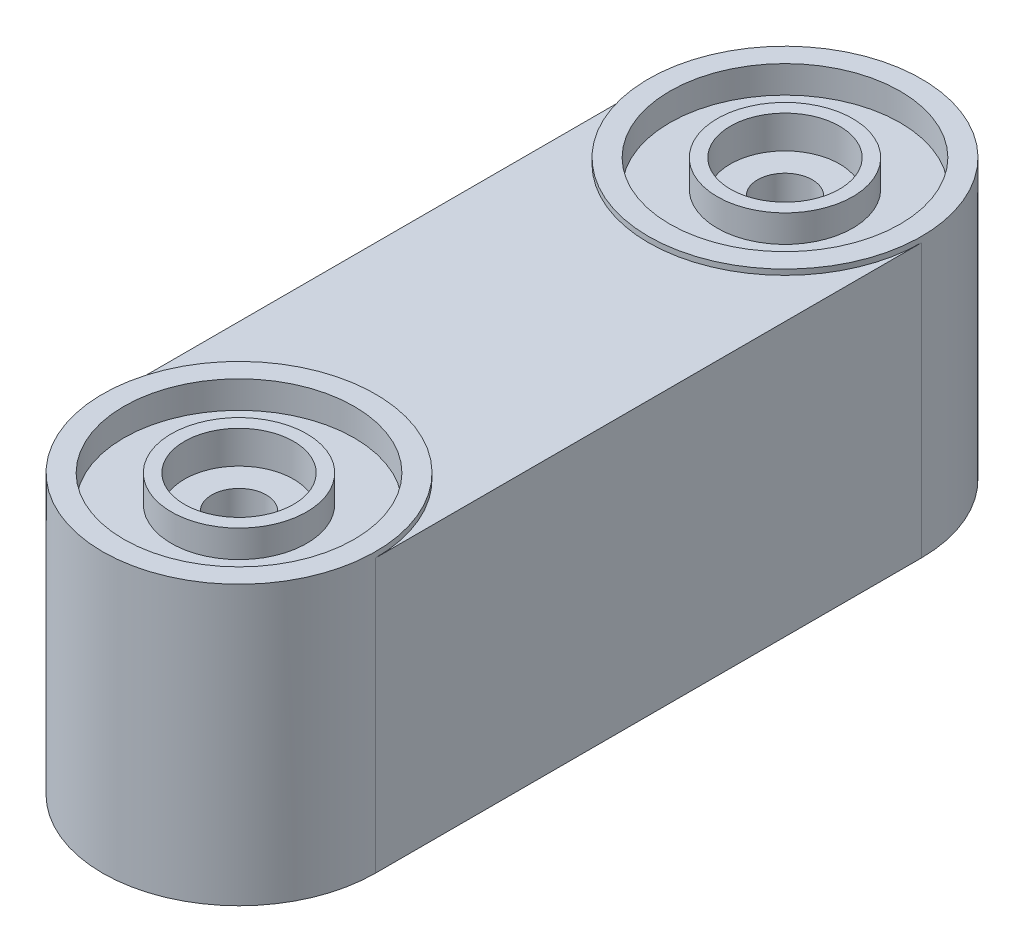
ISO-10303-21;
HEADER;
FILE_DESCRIPTION(('STEP AP214'),'2;1');
FILE_NAME('part.step','',(''),(''),'','','');
FILE_SCHEMA(('AUTOMOTIVE_DESIGN { 1 0 10303 214 1 1 1 1 }'));
ENDSEC;
DATA;
#1=APPLICATION_CONTEXT('core data for automotive mechanical design processes');
#2=APPLICATION_PROTOCOL_DEFINITION('international standard','automotive_design',2000,#1);
#3=PRODUCT_CONTEXT('',#1,'mechanical');
#4=PRODUCT('Part','Part','',(#3));
#5=PRODUCT_RELATED_PRODUCT_CATEGORY('part','',(#4));
#6=PRODUCT_DEFINITION_FORMATION('','',#4);
#7=PRODUCT_DEFINITION_CONTEXT('part definition',#1,'design');
#8=PRODUCT_DEFINITION('design','',#6,#7);
#9=PRODUCT_DEFINITION_SHAPE('','',#8);
#10=(LENGTH_UNIT() NAMED_UNIT(*) SI_UNIT(.MILLI.,.METRE.));
#11=(NAMED_UNIT(*) PLANE_ANGLE_UNIT() SI_UNIT($,.RADIAN.));
#12=(NAMED_UNIT(*) SI_UNIT($,.STERADIAN.) SOLID_ANGLE_UNIT());
#13=UNCERTAINTY_MEASURE_WITH_UNIT(LENGTH_MEASURE(1.E-05),#10,'distance_accuracy_value','');
#14=(GEOMETRIC_REPRESENTATION_CONTEXT(3) GLOBAL_UNCERTAINTY_ASSIGNED_CONTEXT((#13)) GLOBAL_UNIT_ASSIGNED_CONTEXT((#10,
#11,#12)) REPRESENTATION_CONTEXT('',''));
#15=CARTESIAN_POINT('',(0.,0.,0.));
#16=DIRECTION('',(0.,0.,1.));
#17=DIRECTION('',(1.,0.,0.));
#18=AXIS2_PLACEMENT_3D('',#15,#16,#17);
#19=CARTESIAN_POINT('',(0.,26.,0.));
#20=DIRECTION('',(0.,-1.,0.));
#21=DIRECTION('',(0.,0.,-1.));
#22=AXIS2_PLACEMENT_3D('',#19,#20,#21);
#23=PLANE('',#22);
#24=CARTESIAN_POINT('',(0.,26.,125.));
#25=DIRECTION('',(0.,1.,0.));
#26=DIRECTION('',(0.,0.,1.));
#27=AXIS2_PLACEMENT_3D('',#24,#25,#26);
#28=CIRCLE('',#27,10.);
#29=CARTESIAN_POINT('',(0.,26.,135.));
#30=VERTEX_POINT('',#29);
#31=EDGE_CURVE('E193',#30,#30,#28,.T.);
#32=ORIENTED_EDGE('',*,*,#31,.F.);
#33=EDGE_LOOP('',(#32));
#34=FACE_BOUND('',#33,.T.);
#35=CARTESIAN_POINT('',(0.,26.,125.));
#36=DIRECTION('',(0.,1.,0.));
#37=DIRECTION('',(0.,0.,-1.));
#38=AXIS2_PLACEMENT_3D('',#35,#36,#37);
#39=CIRCLE('',#38,12.4);
#40=CARTESIAN_POINT('',(0.,26.,112.6));
#41=VERTEX_POINT('',#40);
#42=EDGE_CURVE('E333',#41,#41,#39,.T.);
#43=ORIENTED_EDGE('',*,*,#42,.T.);
#44=EDGE_LOOP('',(#43));
#45=FACE_BOUND('',#44,.T.);
#46=ADVANCED_FACE('F93',(#34,#45),#23,.F.);
#47=CARTESIAN_POINT('',(0.,26.,0.));
#48=DIRECTION('',(0.,1.,0.));
#49=DIRECTION('',(0.,0.,1.));
#50=AXIS2_PLACEMENT_3D('',#47,#48,#49);
#51=PLANE('',#50);
#52=CARTESIAN_POINT('',(0.,26.,25.));
#53=DIRECTION('',(0.,1.,0.));
#54=DIRECTION('',(0.,0.,1.));
#55=AXIS2_PLACEMENT_3D('',#52,#53,#54);
#56=CIRCLE('',#55,10.);
#57=CARTESIAN_POINT('',(0.,26.,35.));
#58=VERTEX_POINT('',#57);
#59=EDGE_CURVE('E196',#58,#58,#56,.T.);
#60=ORIENTED_EDGE('',*,*,#59,.F.);
#61=EDGE_LOOP('',(#60));
#62=FACE_BOUND('',#61,.T.);
#63=CARTESIAN_POINT('',(0.,26.,25.));
#64=DIRECTION('',(0.,1.,0.));
#65=DIRECTION('',(0.,0.,1.));
#66=AXIS2_PLACEMENT_3D('',#63,#64,#65);
#67=CIRCLE('',#66,12.4);
#68=CARTESIAN_POINT('',(0.,26.,37.4));
#69=VERTEX_POINT('',#68);
#70=EDGE_CURVE('E331',#69,#69,#67,.T.);
#71=ORIENTED_EDGE('',*,*,#70,.T.);
#72=EDGE_LOOP('',(#71));
#73=FACE_BOUND('',#72,.T.);
#74=ADVANCED_FACE('F232',(#62,#73),#51,.T.);
#75=CARTESIAN_POINT('',(0.,-49.,25.));
#76=DIRECTION('',(0.,1.,0.));
#77=DIRECTION('',(0.,0.,1.));
#78=AXIS2_PLACEMENT_3D('',#75,#76,#77);
#79=CYLINDRICAL_SURFACE('',#78,5.);
#80=CARTESIAN_POINT('',(0.,20.,25.));
#81=DIRECTION('',(0.,1.,0.));
#82=DIRECTION('',(0.,0.,1.));
#83=AXIS2_PLACEMENT_3D('',#80,#81,#82);
#84=CIRCLE('',#83,5.);
#85=CARTESIAN_POINT('',(0.,20.,30.));
#86=VERTEX_POINT('',#85);
#87=EDGE_CURVE('E163',#86,#86,#84,.F.);
#88=ORIENTED_EDGE('',*,*,#87,.F.);
#89=EDGE_LOOP('',(#88));
#90=FACE_BOUND('',#89,.T.);
#91=CARTESIAN_POINT('',(0.,-19.,25.));
#92=DIRECTION('',(0.,-1.,0.));
#93=DIRECTION('',(0.,0.,-1.));
#94=AXIS2_PLACEMENT_3D('',#91,#92,#93);
#95=CIRCLE('',#94,5.);
#96=CARTESIAN_POINT('',(0.,-19.,20.));
#97=VERTEX_POINT('',#96);
#98=EDGE_CURVE('E97',#97,#97,#95,.F.);
#99=ORIENTED_EDGE('',*,*,#98,.F.);
#100=EDGE_LOOP('',(#99));
#101=FACE_BOUND('',#100,.T.);
#102=ADVANCED_FACE('F242',(#90,#101),#79,.F.);
#103=CARTESIAN_POINT('',(0.,-49.,125.));
#104=DIRECTION('',(0.,1.,0.));
#105=DIRECTION('',(0.,0.,1.));
#106=AXIS2_PLACEMENT_3D('',#103,#104,#105);
#107=CYLINDRICAL_SURFACE('',#106,5.);
#108=CARTESIAN_POINT('',(0.,20.,125.));
#109=DIRECTION('',(0.,1.,0.));
#110=DIRECTION('',(0.,0.,1.));
#111=AXIS2_PLACEMENT_3D('',#108,#109,#110);
#112=CIRCLE('',#111,5.);
#113=CARTESIAN_POINT('',(0.,20.,130.));
#114=VERTEX_POINT('',#113);
#115=EDGE_CURVE('E160',#114,#114,#112,.F.);
#116=ORIENTED_EDGE('',*,*,#115,.F.);
#117=EDGE_LOOP('',(#116));
#118=FACE_BOUND('',#117,.T.);
#119=CARTESIAN_POINT('',(0.,-19.,125.));
#120=DIRECTION('',(0.,-1.,0.));
#121=DIRECTION('',(0.,0.,-1.));
#122=AXIS2_PLACEMENT_3D('',#119,#120,#121);
#123=CIRCLE('',#122,5.);
#124=CARTESIAN_POINT('',(0.,-19.,120.));
#125=VERTEX_POINT('',#124);
#126=EDGE_CURVE('E166',#125,#125,#123,.F.);
#127=ORIENTED_EDGE('',*,*,#126,.F.);
#128=EDGE_LOOP('',(#127));
#129=FACE_BOUND('',#128,.T.);
#130=ADVANCED_FACE('F268',(#118,#129),#107,.F.);
#131=CARTESIAN_POINT('',(-25.,-25.,150.));
#132=DIRECTION('',(0.,1.,0.));
#133=DIRECTION('',(0.,0.,1.));
#134=AXIS2_PLACEMENT_3D('',#131,#132,#133);
#135=PLANE('',#134);
#136=CARTESIAN_POINT('',(0.,-25.,125.));
#137=DIRECTION('',(0.,-1.,0.));
#138=DIRECTION('',(0.,0.,-1.));
#139=AXIS2_PLACEMENT_3D('',#136,#137,#138);
#140=CIRCLE('',#139,10.);
#141=CARTESIAN_POINT('',(0.,-25.,115.));
#142=VERTEX_POINT('',#141);
#143=EDGE_CURVE('E174',#142,#142,#140,.T.);
#144=ORIENTED_EDGE('',*,*,#143,.F.);
#145=EDGE_LOOP('',(#144));
#146=FACE_BOUND('',#145,.T.);
#147=CARTESIAN_POINT('',(0.,-25.,25.));
#148=DIRECTION('',(0.,-1.,0.));
#149=DIRECTION('',(0.,0.,-1.));
#150=AXIS2_PLACEMENT_3D('',#147,#148,#149);
#151=CIRCLE('',#150,10.);
#152=CARTESIAN_POINT('',(0.,-25.,15.));
#153=VERTEX_POINT('',#152);
#154=EDGE_CURVE('E179',#153,#153,#151,.T.);
#155=ORIENTED_EDGE('',*,*,#154,.F.);
#156=EDGE_LOOP('',(#155));
#157=FACE_BOUND('',#156,.T.);
#158=DIRECTION('',(0.,0.,-1.));
#159=VECTOR('',#158,1.);
#160=CARTESIAN_POINT('',(25.,-25.,150.));
#161=LINE('',#160,#159);
#162=CARTESIAN_POINT('',(25.,-25.,125.));
#163=VERTEX_POINT('',#162);
#164=CARTESIAN_POINT('',(25.,-25.,25.));
#165=VERTEX_POINT('',#164);
#166=EDGE_CURVE('E141',#163,#165,#161,.T.);
#167=ORIENTED_EDGE('',*,*,#166,.F.);
#168=CARTESIAN_POINT('',(0.,-25.,125.));
#169=DIRECTION('',(0.,1.,0.));
#170=DIRECTION('',(0.,0.,1.));
#171=AXIS2_PLACEMENT_3D('',#168,#169,#170);
#172=CIRCLE('',#171,25.);
#173=CARTESIAN_POINT('',(-25.,-25.,125.));
#174=VERTEX_POINT('',#173);
#175=EDGE_CURVE('E131',#174,#163,#172,.T.);
#176=ORIENTED_EDGE('',*,*,#175,.F.);
#177=DIRECTION('',(0.,0.,-1.));
#178=VECTOR('',#177,1.);
#179=CARTESIAN_POINT('',(-25.,-25.,150.));
#180=LINE('',#179,#178);
#181=CARTESIAN_POINT('',(-25.,-25.,25.));
#182=VERTEX_POINT('',#181);
#183=EDGE_CURVE('E149',#174,#182,#180,.T.);
#184=ORIENTED_EDGE('',*,*,#183,.T.);
#185=CARTESIAN_POINT('',(0.,-25.,25.));
#186=DIRECTION('',(0.,1.,0.));
#187=DIRECTION('',(0.,0.,1.));
#188=AXIS2_PLACEMENT_3D('',#185,#186,#187);
#189=CIRCLE('',#188,25.);
#190=EDGE_CURVE('E144',#165,#182,#189,.T.);
#191=ORIENTED_EDGE('',*,*,#190,.F.);
#192=EDGE_LOOP('',(#167,#176,#184,#191));
#193=FACE_BOUND('',#192,.T.);
#194=ADVANCED_FACE('F148',(#146,#157,#193),#135,.F.);
#195=CARTESIAN_POINT('',(25.,-25.,150.));
#196=DIRECTION('',(-1.,0.,0.));
#197=DIRECTION('',(0.,0.,1.));
#198=AXIS2_PLACEMENT_3D('',#195,#196,#197);
#199=PLANE('',#198);
#200=DIRECTION('',(0.,1.,0.));
#201=VECTOR('',#200,1.);
#202=CARTESIAN_POINT('',(25.,-25.,125.));
#203=LINE('',#202,#201);
#204=CARTESIAN_POINT('',(25.,25.,125.));
#205=VERTEX_POINT('',#204);
#206=EDGE_CURVE('E110',#163,#205,#203,.T.);
#207=ORIENTED_EDGE('',*,*,#206,.F.);
#208=ORIENTED_EDGE('',*,*,#166,.T.);
#209=DIRECTION('',(0.,1.,0.));
#210=VECTOR('',#209,1.);
#211=CARTESIAN_POINT('',(25.,-25.,25.));
#212=LINE('',#211,#210);
#213=CARTESIAN_POINT('',(25.,25.,25.));
#214=VERTEX_POINT('',#213);
#215=EDGE_CURVE('E138',#165,#214,#212,.T.);
#216=ORIENTED_EDGE('',*,*,#215,.T.);
#217=DIRECTION('',(0.,0.,-1.));
#218=VECTOR('',#217,1.);
#219=CARTESIAN_POINT('',(25.,25.,150.));
#220=LINE('',#219,#218);
#221=EDGE_CURVE('E12',#205,#214,#220,.T.);
#222=ORIENTED_EDGE('',*,*,#221,.F.);
#223=EDGE_LOOP('',(#207,#208,#216,#222));
#224=FACE_BOUND('',#223,.T.);
#225=ADVANCED_FACE('F95',(#224),#199,.F.);
#226=CARTESIAN_POINT('',(0.,26.,125.));
#227=DIRECTION('',(0.,1.,0.));
#228=DIRECTION('',(0.,0.,-1.));
#229=AXIS2_PLACEMENT_3D('',#226,#227,#228);
#230=CIRCLE('',#229,21.1);
#231=CARTESIAN_POINT('',(0.,26.,103.9));
#232=VERTEX_POINT('',#231);
#233=EDGE_CURVE('E255',#232,#232,#230,.T.);
#234=ORIENTED_EDGE('',*,*,#233,.F.);
#235=EDGE_LOOP('',(#234));
#236=FACE_BOUND('',#235,.T.);
#237=CARTESIAN_POINT('',(0.,26.,125.));
#238=DIRECTION('',(0.,1.,0.));
#239=DIRECTION('',(0.,0.,1.));
#240=AXIS2_PLACEMENT_3D('',#237,#238,#239);
#241=CIRCLE('',#240,25.);
#242=CARTESIAN_POINT('',(0.,26.,150.));
#243=VERTEX_POINT('',#242);
#244=EDGE_CURVE('E150',#243,#243,#241,.T.);
#245=ORIENTED_EDGE('',*,*,#244,.T.);
#246=EDGE_LOOP('',(#245));
#247=FACE_BOUND('',#246,.T.);
#248=ADVANCED_FACE('F237',(#236,#247),#23,.F.);
#249=CARTESIAN_POINT('',(-25.,-25.,150.));
#250=DIRECTION('',(1.,0.,0.));
#251=DIRECTION('',(0.,0.,-1.));
#252=AXIS2_PLACEMENT_3D('',#249,#250,#251);
#253=PLANE('',#252);
#254=DIRECTION('',(0.,0.,-1.));
#255=VECTOR('',#254,1.);
#256=CARTESIAN_POINT('',(-25.,25.,150.));
#257=LINE('',#256,#255);
#258=CARTESIAN_POINT('',(-25.,25.,125.));
#259=VERTEX_POINT('',#258);
#260=CARTESIAN_POINT('',(-25.,25.,25.));
#261=VERTEX_POINT('',#260);
#262=EDGE_CURVE('E103',#259,#261,#257,.T.);
#263=ORIENTED_EDGE('',*,*,#262,.T.);
#264=DIRECTION('',(0.,1.,0.));
#265=VECTOR('',#264,1.);
#266=CARTESIAN_POINT('',(-25.,-25.,25.));
#267=LINE('',#266,#265);
#268=EDGE_CURVE('E145',#182,#261,#267,.T.);
#269=ORIENTED_EDGE('',*,*,#268,.F.);
#270=ORIENTED_EDGE('',*,*,#183,.F.);
#271=DIRECTION('',(0.,1.,0.));
#272=VECTOR('',#271,1.);
#273=CARTESIAN_POINT('',(-25.,-25.,125.));
#274=LINE('',#273,#272);
#275=EDGE_CURVE('E133',#174,#259,#274,.T.);
#276=ORIENTED_EDGE('',*,*,#275,.T.);
#277=EDGE_LOOP('',(#263,#269,#270,#276));
#278=FACE_BOUND('',#277,.T.);
#279=ADVANCED_FACE('F221',(#278),#253,.F.);
#280=CARTESIAN_POINT('',(0.,26.,25.));
#281=DIRECTION('',(0.,1.,0.));
#282=DIRECTION('',(0.,0.,1.));
#283=AXIS2_PLACEMENT_3D('',#280,#281,#282);
#284=CIRCLE('',#283,21.1);
#285=CARTESIAN_POINT('',(0.,26.,46.1));
#286=VERTEX_POINT('',#285);
#287=EDGE_CURVE('E335',#286,#286,#284,.T.);
#288=ORIENTED_EDGE('',*,*,#287,.F.);
#289=EDGE_LOOP('',(#288));
#290=FACE_BOUND('',#289,.T.);
#291=CARTESIAN_POINT('',(0.,26.,25.));
#292=DIRECTION('',(0.,1.,0.));
#293=DIRECTION('',(0.,0.,1.));
#294=AXIS2_PLACEMENT_3D('',#291,#292,#293);
#295=CIRCLE('',#294,25.);
#296=CARTESIAN_POINT('',(0.,26.,50.));
#297=VERTEX_POINT('',#296);
#298=EDGE_CURVE('E207',#297,#297,#295,.T.);
#299=ORIENTED_EDGE('',*,*,#298,.T.);
#300=EDGE_LOOP('',(#299));
#301=FACE_BOUND('',#300,.T.);
#302=ADVANCED_FACE('F212',(#290,#301),#51,.T.);
#303=CARTESIAN_POINT('',(-25.,25.,150.));
#304=DIRECTION('',(0.,-1.,0.));
#305=DIRECTION('',(0.,0.,-1.));
#306=AXIS2_PLACEMENT_3D('',#303,#304,#305);
#307=PLANE('',#306);
#308=CARTESIAN_POINT('',(0.,25.,25.));
#309=DIRECTION('',(0.,1.,0.));
#310=DIRECTION('',(0.,0.,1.));
#311=AXIS2_PLACEMENT_3D('',#308,#309,#310);
#312=CIRCLE('',#311,25.);
#313=EDGE_CURVE('E154',#261,#214,#312,.T.);
#314=ORIENTED_EDGE('',*,*,#313,.F.);
#315=ORIENTED_EDGE('',*,*,#262,.F.);
#316=CARTESIAN_POINT('',(0.,25.,125.));
#317=DIRECTION('',(0.,1.,0.));
#318=DIRECTION('',(0.,0.,1.));
#319=AXIS2_PLACEMENT_3D('',#316,#317,#318);
#320=CIRCLE('',#319,25.);
#321=EDGE_CURVE('E203',#205,#259,#320,.T.);
#322=ORIENTED_EDGE('',*,*,#321,.F.);
#323=ORIENTED_EDGE('',*,*,#221,.T.);
#324=EDGE_LOOP('',(#314,#315,#322,#323));
#325=FACE_BOUND('',#324,.T.);
#326=ADVANCED_FACE('F217',(#325),#307,.F.);
#327=CARTESIAN_POINT('',(0.,25.,25.));
#328=DIRECTION('',(0.,1.,0.));
#329=DIRECTION('',(0.,0.,1.));
#330=AXIS2_PLACEMENT_3D('',#327,#328,#329);
#331=CYLINDRICAL_SURFACE('',#330,25.);
#332=ORIENTED_EDGE('',*,*,#298,.F.);
#333=EDGE_LOOP('',(#332));
#334=FACE_BOUND('',#333,.T.);
#335=ORIENTED_EDGE('',*,*,#190,.T.);
#336=ORIENTED_EDGE('',*,*,#268,.T.);
#337=ORIENTED_EDGE('',*,*,#313,.T.);
#338=ORIENTED_EDGE('',*,*,#215,.F.);
#339=EDGE_LOOP('',(#335,#336,#337,#338));
#340=FACE_BOUND('',#339,.T.);
#341=ADVANCED_FACE('F214',(#334,#340),#331,.T.);
#342=CARTESIAN_POINT('',(0.,25.,125.));
#343=DIRECTION('',(0.,1.,0.));
#344=DIRECTION('',(0.,0.,1.));
#345=AXIS2_PLACEMENT_3D('',#342,#343,#344);
#346=CYLINDRICAL_SURFACE('',#345,25.);
#347=ORIENTED_EDGE('',*,*,#244,.F.);
#348=EDGE_LOOP('',(#347));
#349=FACE_BOUND('',#348,.T.);
#350=ORIENTED_EDGE('',*,*,#175,.T.);
#351=ORIENTED_EDGE('',*,*,#206,.T.);
#352=ORIENTED_EDGE('',*,*,#321,.T.);
#353=ORIENTED_EDGE('',*,*,#275,.F.);
#354=EDGE_LOOP('',(#350,#351,#352,#353));
#355=FACE_BOUND('',#354,.T.);
#356=ADVANCED_FACE('F132',(#349,#355),#346,.T.);
#357=CARTESIAN_POINT('',(0.,20.,125.));
#358=DIRECTION('',(0.,1.,0.));
#359=DIRECTION('',(0.,0.,1.));
#360=AXIS2_PLACEMENT_3D('',#357,#358,#359);
#361=PLANE('',#360);
#362=CARTESIAN_POINT('',(0.,20.,125.));
#363=DIRECTION('',(0.,1.,0.));
#364=DIRECTION('',(0.,0.,1.));
#365=AXIS2_PLACEMENT_3D('',#362,#363,#364);
#366=CIRCLE('',#365,10.);
#367=CARTESIAN_POINT('',(0.,20.,135.));
#368=VERTEX_POINT('',#367);
#369=EDGE_CURVE('E164',#368,#368,#366,.T.);
#370=ORIENTED_EDGE('',*,*,#369,.T.);
#371=EDGE_LOOP('',(#370));
#372=FACE_BOUND('',#371,.T.);
#373=ORIENTED_EDGE('',*,*,#115,.T.);
#374=EDGE_LOOP('',(#373));
#375=FACE_BOUND('',#374,.T.);
#376=ADVANCED_FACE('F259',(#372,#375),#361,.T.);
#377=CARTESIAN_POINT('',(0.,20.,125.));
#378=DIRECTION('',(0.,1.,0.));
#379=DIRECTION('',(0.,0.,1.));
#380=AXIS2_PLACEMENT_3D('',#377,#378,#379);
#381=CYLINDRICAL_SURFACE('',#380,10.);
#382=ORIENTED_EDGE('',*,*,#369,.F.);
#383=EDGE_LOOP('',(#382));
#384=FACE_BOUND('',#383,.T.);
#385=ORIENTED_EDGE('',*,*,#31,.T.);
#386=EDGE_LOOP('',(#385));
#387=FACE_BOUND('',#386,.T.);
#388=ADVANCED_FACE('F264',(#384,#387),#381,.F.);
#389=CARTESIAN_POINT('',(0.,20.,25.));
#390=DIRECTION('',(0.,1.,0.));
#391=DIRECTION('',(0.,0.,1.));
#392=AXIS2_PLACEMENT_3D('',#389,#390,#391);
#393=PLANE('',#392);
#394=CARTESIAN_POINT('',(0.,20.,25.));
#395=DIRECTION('',(0.,1.,0.));
#396=DIRECTION('',(0.,0.,1.));
#397=AXIS2_PLACEMENT_3D('',#394,#395,#396);
#398=CIRCLE('',#397,10.);
#399=CARTESIAN_POINT('',(0.,20.,35.));
#400=VERTEX_POINT('',#399);
#401=EDGE_CURVE('E172',#400,#400,#398,.T.);
#402=ORIENTED_EDGE('',*,*,#401,.T.);
#403=EDGE_LOOP('',(#402));
#404=FACE_BOUND('',#403,.T.);
#405=ORIENTED_EDGE('',*,*,#87,.T.);
#406=EDGE_LOOP('',(#405));
#407=FACE_BOUND('',#406,.T.);
#408=ADVANCED_FACE('F275',(#404,#407),#393,.T.);
#409=CARTESIAN_POINT('',(0.,20.,25.));
#410=DIRECTION('',(0.,1.,0.));
#411=DIRECTION('',(0.,0.,1.));
#412=AXIS2_PLACEMENT_3D('',#409,#410,#411);
#413=CYLINDRICAL_SURFACE('',#412,10.);
#414=ORIENTED_EDGE('',*,*,#401,.F.);
#415=EDGE_LOOP('',(#414));
#416=FACE_BOUND('',#415,.T.);
#417=ORIENTED_EDGE('',*,*,#59,.T.);
#418=EDGE_LOOP('',(#417));
#419=FACE_BOUND('',#418,.T.);
#420=ADVANCED_FACE('F278',(#416,#419),#413,.F.);
#421=CARTESIAN_POINT('',(0.,-19.,25.));
#422=DIRECTION('',(0.,-1.,0.));
#423=DIRECTION('',(0.,0.,-1.));
#424=AXIS2_PLACEMENT_3D('',#421,#422,#423);
#425=PLANE('',#424);
#426=CARTESIAN_POINT('',(0.,-19.,25.));
#427=DIRECTION('',(0.,-1.,0.));
#428=DIRECTION('',(0.,0.,-1.));
#429=AXIS2_PLACEMENT_3D('',#426,#427,#428);
#430=CIRCLE('',#429,10.);
#431=CARTESIAN_POINT('',(0.,-19.,15.));
#432=VERTEX_POINT('',#431);
#433=EDGE_CURVE('E187',#432,#432,#430,.T.);
#434=ORIENTED_EDGE('',*,*,#433,.T.);
#435=EDGE_LOOP('',(#434));
#436=FACE_BOUND('',#435,.T.);
#437=ORIENTED_EDGE('',*,*,#98,.T.);
#438=EDGE_LOOP('',(#437));
#439=FACE_BOUND('',#438,.T.);
#440=ADVANCED_FACE('F282',(#436,#439),#425,.T.);
#441=CARTESIAN_POINT('',(0.,-19.,25.));
#442=DIRECTION('',(0.,-1.,0.));
#443=DIRECTION('',(0.,0.,-1.));
#444=AXIS2_PLACEMENT_3D('',#441,#442,#443);
#445=CYLINDRICAL_SURFACE('',#444,10.);
#446=ORIENTED_EDGE('',*,*,#433,.F.);
#447=EDGE_LOOP('',(#446));
#448=FACE_BOUND('',#447,.T.);
#449=ORIENTED_EDGE('',*,*,#154,.T.);
#450=EDGE_LOOP('',(#449));
#451=FACE_BOUND('',#450,.T.);
#452=ADVANCED_FACE('F289',(#448,#451),#445,.F.);
#453=CARTESIAN_POINT('',(0.,-19.,125.));
#454=DIRECTION('',(0.,-1.,0.));
#455=DIRECTION('',(0.,0.,-1.));
#456=AXIS2_PLACEMENT_3D('',#453,#454,#455);
#457=PLANE('',#456);
#458=CARTESIAN_POINT('',(0.,-19.,125.));
#459=DIRECTION('',(0.,-1.,0.));
#460=DIRECTION('',(0.,0.,-1.));
#461=AXIS2_PLACEMENT_3D('',#458,#459,#460);
#462=CIRCLE('',#461,10.);
#463=CARTESIAN_POINT('',(0.,-19.,115.));
#464=VERTEX_POINT('',#463);
#465=EDGE_CURVE('E168',#464,#464,#462,.T.);
#466=ORIENTED_EDGE('',*,*,#465,.T.);
#467=EDGE_LOOP('',(#466));
#468=FACE_BOUND('',#467,.T.);
#469=ORIENTED_EDGE('',*,*,#126,.T.);
#470=EDGE_LOOP('',(#469));
#471=FACE_BOUND('',#470,.T.);
#472=ADVANCED_FACE('F293',(#468,#471),#457,.T.);
#473=CARTESIAN_POINT('',(0.,-19.,125.));
#474=DIRECTION('',(0.,-1.,0.));
#475=DIRECTION('',(0.,0.,-1.));
#476=AXIS2_PLACEMENT_3D('',#473,#474,#475);
#477=CYLINDRICAL_SURFACE('',#476,10.);
#478=ORIENTED_EDGE('',*,*,#465,.F.);
#479=EDGE_LOOP('',(#478));
#480=FACE_BOUND('',#479,.T.);
#481=ORIENTED_EDGE('',*,*,#143,.T.);
#482=EDGE_LOOP('',(#481));
#483=FACE_BOUND('',#482,.T.);
#484=ADVANCED_FACE('F295',(#480,#483),#477,.F.);
#485=CARTESIAN_POINT('',(0.,21.,25.));
#486=DIRECTION('',(0.,1.,0.));
#487=DIRECTION('',(0.,0.,1.));
#488=AXIS2_PLACEMENT_3D('',#485,#486,#487);
#489=CYLINDRICAL_SURFACE('',#488,21.1);
#490=CARTESIAN_POINT('',(0.,21.,25.));
#491=DIRECTION('',(0.,1.,0.));
#492=DIRECTION('',(0.,0.,1.));
#493=AXIS2_PLACEMENT_3D('',#490,#491,#492);
#494=CIRCLE('',#493,21.1);
#495=CARTESIAN_POINT('',(0.,21.,46.1));
#496=VERTEX_POINT('',#495);
#497=EDGE_CURVE('E190',#496,#496,#494,.T.);
#498=ORIENTED_EDGE('',*,*,#497,.F.);
#499=EDGE_LOOP('',(#498));
#500=FACE_BOUND('',#499,.T.);
#501=ORIENTED_EDGE('',*,*,#287,.T.);
#502=EDGE_LOOP('',(#501));
#503=FACE_BOUND('',#502,.T.);
#504=ADVANCED_FACE('F297',(#500,#503),#489,.F.);
#505=CARTESIAN_POINT('',(0.,21.,25.));
#506=DIRECTION('',(0.,1.,0.));
#507=DIRECTION('',(0.,0.,1.));
#508=AXIS2_PLACEMENT_3D('',#505,#506,#507);
#509=PLANE('',#508);
#510=CARTESIAN_POINT('',(0.,21.,25.));
#511=DIRECTION('',(0.,1.,0.));
#512=DIRECTION('',(0.,0.,1.));
#513=AXIS2_PLACEMENT_3D('',#510,#511,#512);
#514=CIRCLE('',#513,12.4);
#515=CARTESIAN_POINT('',(0.,21.,37.4));
#516=VERTEX_POINT('',#515);
#517=EDGE_CURVE('E328',#516,#516,#514,.T.);
#518=ORIENTED_EDGE('',*,*,#517,.F.);
#519=EDGE_LOOP('',(#518));
#520=FACE_BOUND('',#519,.T.);
#521=ORIENTED_EDGE('',*,*,#497,.T.);
#522=EDGE_LOOP('',(#521));
#523=FACE_BOUND('',#522,.T.);
#524=ADVANCED_FACE('F316',(#520,#523),#509,.T.);
#525=CARTESIAN_POINT('',(0.,21.,25.));
#526=DIRECTION('',(0.,1.,0.));
#527=DIRECTION('',(0.,0.,1.));
#528=AXIS2_PLACEMENT_3D('',#525,#526,#527);
#529=CYLINDRICAL_SURFACE('',#528,12.4);
#530=ORIENTED_EDGE('',*,*,#517,.T.);
#531=EDGE_LOOP('',(#530));
#532=FACE_BOUND('',#531,.T.);
#533=ORIENTED_EDGE('',*,*,#70,.F.);
#534=EDGE_LOOP('',(#533));
#535=FACE_BOUND('',#534,.T.);
#536=ADVANCED_FACE('F312',(#532,#535),#529,.T.);
#537=CARTESIAN_POINT('',(0.,21.,125.));
#538=DIRECTION('',(0.,1.,0.));
#539=DIRECTION('',(0.,0.,1.));
#540=AXIS2_PLACEMENT_3D('',#537,#538,#539);
#541=CYLINDRICAL_SURFACE('',#540,21.1);
#542=CARTESIAN_POINT('',(0.,21.,125.));
#543=DIRECTION('',(0.,1.,0.));
#544=DIRECTION('',(0.,0.,-1.));
#545=AXIS2_PLACEMENT_3D('',#542,#543,#544);
#546=CIRCLE('',#545,21.1);
#547=CARTESIAN_POINT('',(0.,21.,103.9));
#548=VERTEX_POINT('',#547);
#549=EDGE_CURVE('E344',#548,#548,#546,.T.);
#550=ORIENTED_EDGE('',*,*,#549,.F.);
#551=EDGE_LOOP('',(#550));
#552=FACE_BOUND('',#551,.T.);
#553=ORIENTED_EDGE('',*,*,#233,.T.);
#554=EDGE_LOOP('',(#553));
#555=FACE_BOUND('',#554,.T.);
#556=ADVANCED_FACE('F308',(#552,#555),#541,.F.);
#557=CARTESIAN_POINT('',(0.,21.,125.));
#558=DIRECTION('',(0.,-1.,0.));
#559=DIRECTION('',(0.,0.,-1.));
#560=AXIS2_PLACEMENT_3D('',#557,#558,#559);
#561=PLANE('',#560);
#562=CARTESIAN_POINT('',(0.,21.,125.));
#563=DIRECTION('',(0.,1.,0.));
#564=DIRECTION('',(0.,0.,-1.));
#565=AXIS2_PLACEMENT_3D('',#562,#563,#564);
#566=CIRCLE('',#565,12.4);
#567=CARTESIAN_POINT('',(0.,21.,112.6));
#568=VERTEX_POINT('',#567);
#569=EDGE_CURVE('E182',#568,#568,#566,.T.);
#570=ORIENTED_EDGE('',*,*,#569,.F.);
#571=EDGE_LOOP('',(#570));
#572=FACE_BOUND('',#571,.T.);
#573=ORIENTED_EDGE('',*,*,#549,.T.);
#574=EDGE_LOOP('',(#573));
#575=FACE_BOUND('',#574,.T.);
#576=ADVANCED_FACE('F304',(#572,#575),#561,.F.);
#577=CARTESIAN_POINT('',(0.,21.,125.));
#578=DIRECTION('',(0.,1.,0.));
#579=DIRECTION('',(0.,0.,1.));
#580=AXIS2_PLACEMENT_3D('',#577,#578,#579);
#581=CYLINDRICAL_SURFACE('',#580,12.4);
#582=ORIENTED_EDGE('',*,*,#569,.T.);
#583=EDGE_LOOP('',(#582));
#584=FACE_BOUND('',#583,.T.);
#585=ORIENTED_EDGE('',*,*,#42,.F.);
#586=EDGE_LOOP('',(#585));
#587=FACE_BOUND('',#586,.T.);
#588=ADVANCED_FACE('F301',(#584,#587),#581,.T.);
#589=CLOSED_SHELL('',(#46,#74,#102,#130,#194,#225,#248,#279,#302,#326,#341,#356,#376,#388,#408,
#420,#440,#452,#472,#484,#504,#524,#536,#556,#576,#588));
#590=MANIFOLD_SOLID_BREP('B2',#589);
#591=ADVANCED_BREP_SHAPE_REPRESENTATION('',(#18,#590),#14);
#592=SHAPE_DEFINITION_REPRESENTATION(#9,#591);
ENDSEC;
END-ISO-10303-21;
